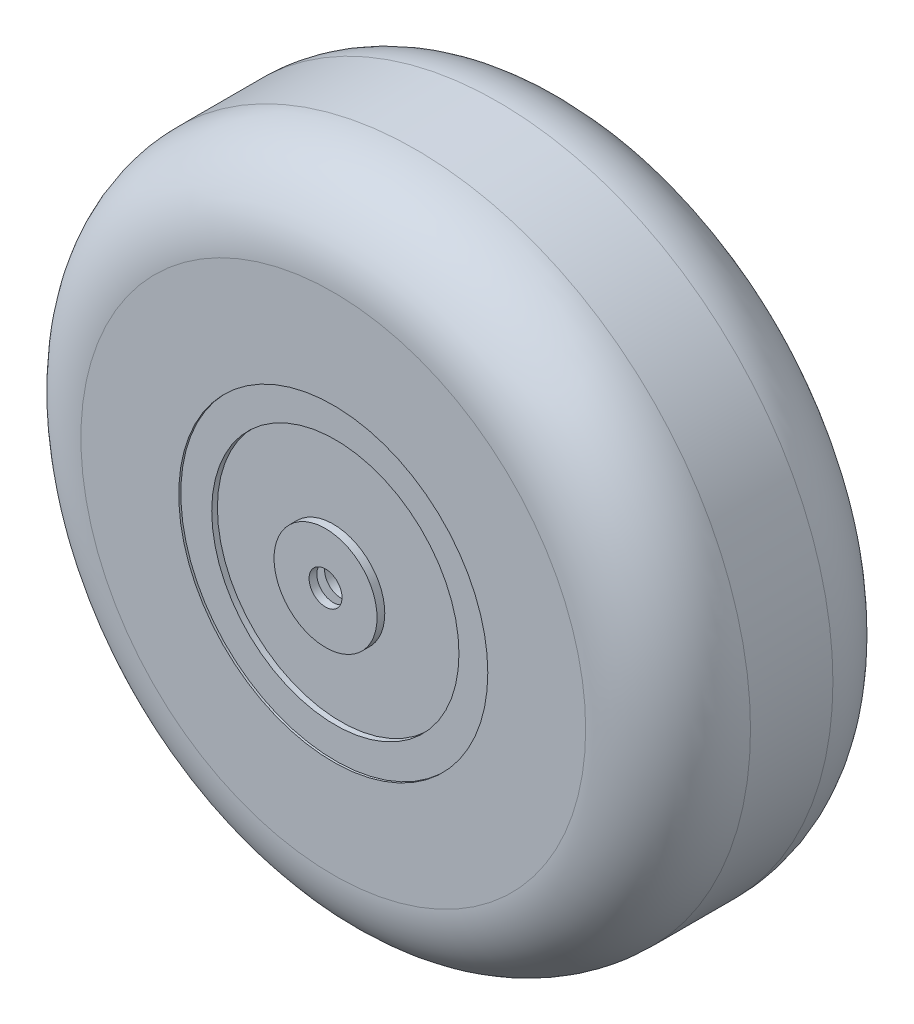
ISO-10303-21;
HEADER;
FILE_DESCRIPTION(('STEP AP214'),'2;1');
FILE_NAME('part.step','',(''),(''),'','','');
FILE_SCHEMA(('AUTOMOTIVE_DESIGN { 1 0 10303 214 1 1 1 1 }'));
ENDSEC;
DATA;
#1=APPLICATION_CONTEXT('core data for automotive mechanical design processes');
#2=APPLICATION_PROTOCOL_DEFINITION('international standard','automotive_design',2000,#1);
#3=PRODUCT_CONTEXT('',#1,'mechanical');
#4=PRODUCT('Part','Part','',(#3));
#5=PRODUCT_RELATED_PRODUCT_CATEGORY('part','',(#4));
#6=PRODUCT_DEFINITION_FORMATION('','',#4);
#7=PRODUCT_DEFINITION_CONTEXT('part definition',#1,'design');
#8=PRODUCT_DEFINITION('design','',#6,#7);
#9=PRODUCT_DEFINITION_SHAPE('','',#8);
#10=(LENGTH_UNIT() NAMED_UNIT(*) SI_UNIT(.MILLI.,.METRE.));
#11=(NAMED_UNIT(*) PLANE_ANGLE_UNIT() SI_UNIT($,.RADIAN.));
#12=(NAMED_UNIT(*) SI_UNIT($,.STERADIAN.) SOLID_ANGLE_UNIT());
#13=UNCERTAINTY_MEASURE_WITH_UNIT(LENGTH_MEASURE(1.E-05),#10,'distance_accuracy_value','');
#14=(GEOMETRIC_REPRESENTATION_CONTEXT(3) GLOBAL_UNCERTAINTY_ASSIGNED_CONTEXT((#13)) GLOBAL_UNIT_ASSIGNED_CONTEXT((#10,
#11,#12)) REPRESENTATION_CONTEXT('',''));
#15=CARTESIAN_POINT('',(0.,0.,0.));
#16=DIRECTION('',(0.,0.,1.));
#17=DIRECTION('',(1.,0.,0.));
#18=AXIS2_PLACEMENT_3D('',#15,#16,#17);
#19=CARTESIAN_POINT('',(0.,0.,24.));
#20=DIRECTION('',(0.,0.,-1.));
#21=DIRECTION('',(-1.,0.,0.));
#22=AXIS2_PLACEMENT_3D('',#19,#20,#21);
#23=CYLINDRICAL_SURFACE('',#22,1.6);
#24=CARTESIAN_POINT('',(0.,0.,0.750000000000001));
#25=DIRECTION('',(0.,0.,-1.));
#26=DIRECTION('',(-1.,0.,0.));
#27=AXIS2_PLACEMENT_3D('',#24,#25,#26);
#28=CIRCLE('',#27,1.6);
#29=CARTESIAN_POINT('',(-1.6,0.,0.750000000000001));
#30=VERTEX_POINT('',#29);
#31=EDGE_CURVE('E62',#30,#30,#28,.T.);
#32=ORIENTED_EDGE('',*,*,#31,.T.);
#33=EDGE_LOOP('',(#32));
#34=FACE_BOUND('',#33,.T.);
#35=CARTESIAN_POINT('',(0.,0.,23.25));
#36=DIRECTION('',(0.,0.,1.));
#37=DIRECTION('',(1.,0.,0.));
#38=AXIS2_PLACEMENT_3D('',#35,#36,#37);
#39=CIRCLE('',#38,1.6);
#40=CARTESIAN_POINT('',(1.6,0.,23.25));
#41=VERTEX_POINT('',#40);
#42=EDGE_CURVE('E65',#41,#41,#39,.T.);
#43=ORIENTED_EDGE('',*,*,#42,.T.);
#44=EDGE_LOOP('',(#43));
#45=FACE_BOUND('',#44,.T.);
#46=ADVANCED_FACE('F45',(#34,#45),#23,.F.);
#47=CARTESIAN_POINT('',(0.,0.,24.));
#48=DIRECTION('',(0.,0.,1.));
#49=DIRECTION('',(1.,0.,0.));
#50=AXIS2_PLACEMENT_3D('',#47,#48,#49);
#51=PLANE('',#50);
#52=CARTESIAN_POINT('',(0.,0.,24.));
#53=DIRECTION('',(0.,0.,1.));
#54=DIRECTION('',(1.,0.,0.));
#55=AXIS2_PLACEMENT_3D('',#52,#53,#54);
#56=CIRCLE('',#55,15.);
#57=CARTESIAN_POINT('',(15.,0.,24.));
#58=VERTEX_POINT('',#57);
#59=EDGE_CURVE('E59',#58,#58,#56,.T.);
#60=ORIENTED_EDGE('',*,*,#59,.F.);
#61=EDGE_LOOP('',(#60));
#62=FACE_BOUND('',#61,.T.);
#63=CARTESIAN_POINT('',(0.,0.,24.));
#64=DIRECTION('',(0.,0.,1.));
#65=DIRECTION('',(1.,0.,0.));
#66=AXIS2_PLACEMENT_3D('',#63,#64,#65);
#67=CIRCLE('',#66,24.5);
#68=CARTESIAN_POINT('',(24.5,0.,24.));
#69=VERTEX_POINT('',#68);
#70=EDGE_CURVE('E67',#69,#69,#67,.T.);
#71=ORIENTED_EDGE('',*,*,#70,.T.);
#72=EDGE_LOOP('',(#71));
#73=FACE_BOUND('',#72,.T.);
#74=ADVANCED_FACE('F102',(#62,#73),#51,.T.);
#75=CARTESIAN_POINT('',(0.,0.,0.));
#76=DIRECTION('',(0.,0.,1.));
#77=DIRECTION('',(1.,0.,0.));
#78=AXIS2_PLACEMENT_3D('',#75,#76,#77);
#79=PLANE('',#78);
#80=CARTESIAN_POINT('',(0.,0.,0.));
#81=DIRECTION('',(0.,0.,-1.));
#82=DIRECTION('',(-1.,0.,0.));
#83=AXIS2_PLACEMENT_3D('',#80,#81,#82);
#84=CIRCLE('',#83,15.);
#85=CARTESIAN_POINT('',(-15.,0.,0.));
#86=VERTEX_POINT('',#85);
#87=EDGE_CURVE('E83',#86,#86,#84,.T.);
#88=ORIENTED_EDGE('',*,*,#87,.F.);
#89=EDGE_LOOP('',(#88));
#90=FACE_BOUND('',#89,.T.);
#91=CARTESIAN_POINT('',(0.,0.,0.));
#92=DIRECTION('',(0.,0.,1.));
#93=DIRECTION('',(1.,0.,0.));
#94=AXIS2_PLACEMENT_3D('',#91,#92,#93);
#95=CIRCLE('',#94,24.5);
#96=CARTESIAN_POINT('',(24.5,0.,0.));
#97=VERTEX_POINT('',#96);
#98=EDGE_CURVE('E70',#97,#97,#95,.F.);
#99=ORIENTED_EDGE('',*,*,#98,.T.);
#100=EDGE_LOOP('',(#99));
#101=FACE_BOUND('',#100,.T.);
#102=ADVANCED_FACE('F98',(#90,#101),#79,.F.);
#103=CARTESIAN_POINT('',(0.,0.,24.));
#104=DIRECTION('',(0.,0.,-1.));
#105=DIRECTION('',(-1.,0.,0.));
#106=AXIS2_PLACEMENT_3D('',#103,#104,#105);
#107=CYLINDRICAL_SURFACE('',#106,32.5);
#108=CARTESIAN_POINT('',(0.,0.,8.));
#109=DIRECTION('',(0.,0.,1.));
#110=DIRECTION('',(1.,0.,0.));
#111=AXIS2_PLACEMENT_3D('',#108,#109,#110);
#112=CIRCLE('',#111,32.5);
#113=CARTESIAN_POINT('',(32.5,0.,8.));
#114=VERTEX_POINT('',#113);
#115=EDGE_CURVE('E73',#114,#114,#112,.T.);
#116=ORIENTED_EDGE('',*,*,#115,.T.);
#117=EDGE_LOOP('',(#116));
#118=FACE_BOUND('',#117,.T.);
#119=CARTESIAN_POINT('',(0.,0.,16.));
#120=DIRECTION('',(0.,0.,1.));
#121=DIRECTION('',(1.,0.,0.));
#122=AXIS2_PLACEMENT_3D('',#119,#120,#121);
#123=CIRCLE('',#122,32.5);
#124=CARTESIAN_POINT('',(32.5,0.,16.));
#125=VERTEX_POINT('',#124);
#126=EDGE_CURVE('E76',#125,#125,#123,.F.);
#127=ORIENTED_EDGE('',*,*,#126,.T.);
#128=EDGE_LOOP('',(#127));
#129=FACE_BOUND('',#128,.T.);
#130=ADVANCED_FACE('F101',(#118,#129),#107,.T.);
#131=CARTESIAN_POINT('',(0.,0.,8.));
#132=DIRECTION('',(0.,0.,1.));
#133=DIRECTION('',(1.,0.,0.));
#134=AXIS2_PLACEMENT_3D('',#131,#132,#133);
#135=TOROIDAL_SURFACE('',#134,24.5,8.);
#136=ORIENTED_EDGE('',*,*,#98,.F.);
#137=EDGE_LOOP('',(#136));
#138=FACE_BOUND('',#137,.T.);
#139=ORIENTED_EDGE('',*,*,#115,.F.);
#140=EDGE_LOOP('',(#139));
#141=FACE_BOUND('',#140,.T.);
#142=ADVANCED_FACE('F106',(#138,#141),#135,.T.);
#143=CARTESIAN_POINT('',(0.,0.,16.));
#144=DIRECTION('',(0.,0.,1.));
#145=DIRECTION('',(1.,0.,0.));
#146=AXIS2_PLACEMENT_3D('',#143,#144,#145);
#147=TOROIDAL_SURFACE('',#146,24.5,8.);
#148=ORIENTED_EDGE('',*,*,#126,.F.);
#149=EDGE_LOOP('',(#148));
#150=FACE_BOUND('',#149,.T.);
#151=ORIENTED_EDGE('',*,*,#70,.F.);
#152=EDGE_LOOP('',(#151));
#153=FACE_BOUND('',#152,.T.);
#154=ADVANCED_FACE('F109',(#150,#153),#147,.T.);
#155=CARTESIAN_POINT('',(0.,0.,23.8));
#156=DIRECTION('',(0.,0.,1.));
#157=DIRECTION('',(1.,0.,0.));
#158=AXIS2_PLACEMENT_3D('',#155,#156,#157);
#159=CYLINDRICAL_SURFACE('',#158,15.);
#160=CARTESIAN_POINT('',(0.,0.,23.8));
#161=DIRECTION('',(0.,0.,1.));
#162=DIRECTION('',(1.,0.,0.));
#163=AXIS2_PLACEMENT_3D('',#160,#161,#162);
#164=CIRCLE('',#163,15.);
#165=CARTESIAN_POINT('',(15.,0.,23.8));
#166=VERTEX_POINT('',#165);
#167=EDGE_CURVE('E55',#166,#166,#164,.T.);
#168=ORIENTED_EDGE('',*,*,#167,.F.);
#169=EDGE_LOOP('',(#168));
#170=FACE_BOUND('',#169,.T.);
#171=ORIENTED_EDGE('',*,*,#59,.T.);
#172=EDGE_LOOP('',(#171));
#173=FACE_BOUND('',#172,.T.);
#174=ADVANCED_FACE('F120',(#170,#173),#159,.F.);
#175=CARTESIAN_POINT('',(0.,0.,23.8));
#176=DIRECTION('',(0.,0.,1.));
#177=DIRECTION('',(1.,0.,0.));
#178=AXIS2_PLACEMENT_3D('',#175,#176,#177);
#179=PLANE('',#178);
#180=CARTESIAN_POINT('',(0.,0.,23.8));
#181=DIRECTION('',(0.,0.,1.));
#182=DIRECTION('',(1.,0.,0.));
#183=AXIS2_PLACEMENT_3D('',#180,#181,#182);
#184=CIRCLE('',#183,12.);
#185=CARTESIAN_POINT('',(12.,0.,23.8));
#186=VERTEX_POINT('',#185);
#187=EDGE_CURVE('E51',#186,#186,#184,.T.);
#188=ORIENTED_EDGE('',*,*,#187,.F.);
#189=EDGE_LOOP('',(#188));
#190=FACE_BOUND('',#189,.T.);
#191=ORIENTED_EDGE('',*,*,#167,.T.);
#192=EDGE_LOOP('',(#191));
#193=FACE_BOUND('',#192,.T.);
#194=ADVANCED_FACE('F160',(#190,#193),#179,.T.);
#195=CARTESIAN_POINT('',(0.,0.,0.75));
#196=DIRECTION('',(0.,0.,-1.));
#197=DIRECTION('',(-1.,0.,0.));
#198=AXIS2_PLACEMENT_3D('',#195,#196,#197);
#199=PLANE('',#198);
#200=ORIENTED_EDGE('',*,*,#31,.F.);
#201=EDGE_LOOP('',(#200));
#202=FACE_BOUND('',#201,.T.);
#203=CARTESIAN_POINT('',(0.,0.,0.75));
#204=DIRECTION('',(0.,0.,-1.));
#205=DIRECTION('',(-1.,0.,0.));
#206=AXIS2_PLACEMENT_3D('',#203,#204,#205);
#207=CIRCLE('',#206,15.);
#208=CARTESIAN_POINT('',(-15.,0.,0.75));
#209=VERTEX_POINT('',#208);
#210=EDGE_CURVE('E66',#209,#209,#207,.T.);
#211=ORIENTED_EDGE('',*,*,#210,.T.);
#212=EDGE_LOOP('',(#211));
#213=FACE_BOUND('',#212,.T.);
#214=ADVANCED_FACE('F89',(#202,#213),#199,.T.);
#215=CARTESIAN_POINT('',(0.,0.,23.25));
#216=DIRECTION('',(0.,0.,1.));
#217=DIRECTION('',(1.,0.,0.));
#218=AXIS2_PLACEMENT_3D('',#215,#216,#217);
#219=CYLINDRICAL_SURFACE('',#218,12.);
#220=ORIENTED_EDGE('',*,*,#187,.T.);
#221=EDGE_LOOP('',(#220));
#222=FACE_BOUND('',#221,.T.);
#223=CARTESIAN_POINT('',(0.,0.,23.25));
#224=DIRECTION('',(0.,0.,1.));
#225=DIRECTION('',(1.,0.,0.));
#226=AXIS2_PLACEMENT_3D('',#223,#224,#225);
#227=CIRCLE('',#226,12.);
#228=CARTESIAN_POINT('',(12.,0.,23.25));
#229=VERTEX_POINT('',#228);
#230=EDGE_CURVE('E11',#229,#229,#227,.T.);
#231=ORIENTED_EDGE('',*,*,#230,.F.);
#232=EDGE_LOOP('',(#231));
#233=FACE_BOUND('',#232,.T.);
#234=ADVANCED_FACE('F135',(#222,#233),#219,.F.);
#235=CARTESIAN_POINT('',(0.,0.,23.25));
#236=DIRECTION('',(0.,0.,1.));
#237=DIRECTION('',(1.,0.,0.));
#238=AXIS2_PLACEMENT_3D('',#235,#236,#237);
#239=PLANE('',#238);
#240=ORIENTED_EDGE('',*,*,#42,.F.);
#241=EDGE_LOOP('',(#240));
#242=FACE_BOUND('',#241,.T.);
#243=ORIENTED_EDGE('',*,*,#230,.T.);
#244=EDGE_LOOP('',(#243));
#245=FACE_BOUND('',#244,.T.);
#246=ADVANCED_FACE('F94',(#242,#245),#239,.T.);
#247=CARTESIAN_POINT('',(0.,0.,0.75));
#248=DIRECTION('',(0.,0.,-1.));
#249=DIRECTION('',(-1.,0.,0.));
#250=AXIS2_PLACEMENT_3D('',#247,#248,#249);
#251=CYLINDRICAL_SURFACE('',#250,15.);
#252=ORIENTED_EDGE('',*,*,#210,.F.);
#253=EDGE_LOOP('',(#252));
#254=FACE_BOUND('',#253,.T.);
#255=ORIENTED_EDGE('',*,*,#87,.T.);
#256=EDGE_LOOP('',(#255));
#257=FACE_BOUND('',#256,.T.);
#258=ADVANCED_FACE('F91',(#254,#257),#251,.F.);
#259=CLOSED_SHELL('',(#46,#74,#102,#130,#142,#154,#174,#194,#214,#234,#246,#258));
#260=MANIFOLD_SOLID_BREP('B2',#259);
#261=CARTESIAN_POINT('',(0.,0.,24.));
#262=DIRECTION('',(0.,0.,-1.));
#263=DIRECTION('',(-1.,0.,0.));
#264=AXIS2_PLACEMENT_3D('',#261,#262,#263);
#265=CYLINDRICAL_SURFACE('',#264,1.6);
#266=CARTESIAN_POINT('',(0.,0.,24.));
#267=DIRECTION('',(0.,0.,1.));
#268=DIRECTION('',(1.,0.,0.));
#269=AXIS2_PLACEMENT_3D('',#266,#267,#268);
#270=CIRCLE('',#269,1.6);
#271=CARTESIAN_POINT('',(1.6,0.,24.));
#272=VERTEX_POINT('',#271);
#273=EDGE_CURVE('E265',#272,#272,#270,.T.);
#274=ORIENTED_EDGE('',*,*,#273,.F.);
#275=EDGE_LOOP('',(#274));
#276=FACE_BOUND('',#275,.T.);
#277=CARTESIAN_POINT('',(0.,0.,24.75));
#278=DIRECTION('',(0.,0.,1.));
#279=DIRECTION('',(1.,0.,0.));
#280=AXIS2_PLACEMENT_3D('',#277,#278,#279);
#281=CIRCLE('',#280,1.6);
#282=CARTESIAN_POINT('',(1.6,0.,24.75));
#283=VERTEX_POINT('',#282);
#284=EDGE_CURVE('E258',#283,#283,#281,.T.);
#285=ORIENTED_EDGE('',*,*,#284,.T.);
#286=EDGE_LOOP('',(#285));
#287=FACE_BOUND('',#286,.T.);
#288=ADVANCED_FACE('F255',(#276,#287),#265,.F.);
#289=CARTESIAN_POINT('',(0.,0.,24.75));
#290=DIRECTION('',(0.,0.,1.));
#291=DIRECTION('',(1.,0.,0.));
#292=AXIS2_PLACEMENT_3D('',#289,#290,#291);
#293=PLANE('',#292);
#294=ORIENTED_EDGE('',*,*,#284,.F.);
#295=EDGE_LOOP('',(#294));
#296=FACE_BOUND('',#295,.T.);
#297=CARTESIAN_POINT('',(0.,0.,24.75));
#298=DIRECTION('',(0.,0.,1.));
#299=DIRECTION('',(1.,0.,0.));
#300=AXIS2_PLACEMENT_3D('',#297,#298,#299);
#301=CIRCLE('',#300,5.);
#302=CARTESIAN_POINT('',(5.,0.,24.75));
#303=VERTEX_POINT('',#302);
#304=EDGE_CURVE('E44',#303,#303,#301,.T.);
#305=ORIENTED_EDGE('',*,*,#304,.T.);
#306=EDGE_LOOP('',(#305));
#307=FACE_BOUND('',#306,.T.);
#308=ADVANCED_FACE('F282',(#296,#307),#293,.T.);
#309=CARTESIAN_POINT('',(0.,0.,24.75));
#310=DIRECTION('',(0.,0.,-1.));
#311=DIRECTION('',(-1.,0.,0.));
#312=AXIS2_PLACEMENT_3D('',#309,#310,#311);
#313=CYLINDRICAL_SURFACE('',#312,5.);
#314=ORIENTED_EDGE('',*,*,#304,.F.);
#315=EDGE_LOOP('',(#314));
#316=FACE_BOUND('',#315,.T.);
#317=CARTESIAN_POINT('',(0.,0.,24.));
#318=DIRECTION('',(0.,0.,1.));
#319=DIRECTION('',(1.,0.,0.));
#320=AXIS2_PLACEMENT_3D('',#317,#318,#319);
#321=CIRCLE('',#320,5.);
#322=CARTESIAN_POINT('',(5.,0.,24.));
#323=VERTEX_POINT('',#322);
#324=EDGE_CURVE('E269',#323,#323,#321,.T.);
#325=ORIENTED_EDGE('',*,*,#324,.T.);
#326=EDGE_LOOP('',(#325));
#327=FACE_BOUND('',#326,.T.);
#328=ADVANCED_FACE('F273',(#316,#327),#313,.T.);
#329=CARTESIAN_POINT('',(0.,0.,24.));
#330=DIRECTION('',(0.,0.,1.));
#331=DIRECTION('',(1.,0.,0.));
#332=AXIS2_PLACEMENT_3D('',#329,#330,#331);
#333=PLANE('',#332);
#334=ORIENTED_EDGE('',*,*,#273,.T.);
#335=EDGE_LOOP('',(#334));
#336=FACE_BOUND('',#335,.T.);
#337=ORIENTED_EDGE('',*,*,#324,.F.);
#338=EDGE_LOOP('',(#337));
#339=FACE_BOUND('',#338,.T.);
#340=ADVANCED_FACE('F275',(#336,#339),#333,.F.);
#341=CLOSED_SHELL('',(#288,#308,#328,#340));
#342=MANIFOLD_SOLID_BREP('B6',#341);
#343=CARTESIAN_POINT('',(0.,0.,-0.75));
#344=DIRECTION('',(0.,0.,1.));
#345=DIRECTION('',(1.,0.,0.));
#346=AXIS2_PLACEMENT_3D('',#343,#344,#345);
#347=CYLINDRICAL_SURFACE('',#346,5.);
#348=CARTESIAN_POINT('',(0.,0.,-0.75));
#349=DIRECTION('',(0.,0.,-1.));
#350=DIRECTION('',(-1.,0.,0.));
#351=AXIS2_PLACEMENT_3D('',#348,#349,#350);
#352=CIRCLE('',#351,5.);
#353=CARTESIAN_POINT('',(-5.,0.,-0.75));
#354=VERTEX_POINT('',#353);
#355=EDGE_CURVE('E254',#354,#354,#352,.T.);
#356=ORIENTED_EDGE('',*,*,#355,.F.);
#357=EDGE_LOOP('',(#356));
#358=FACE_BOUND('',#357,.T.);
#359=CARTESIAN_POINT('',(0.,0.,0.));
#360=DIRECTION('',(0.,0.,-1.));
#361=DIRECTION('',(-1.,0.,0.));
#362=AXIS2_PLACEMENT_3D('',#359,#360,#361);
#363=CIRCLE('',#362,5.);
#364=CARTESIAN_POINT('',(-5.,0.,0.));
#365=VERTEX_POINT('',#364);
#366=EDGE_CURVE('E333',#365,#365,#363,.T.);
#367=ORIENTED_EDGE('',*,*,#366,.T.);
#368=EDGE_LOOP('',(#367));
#369=FACE_BOUND('',#368,.T.);
#370=ADVANCED_FACE('F321',(#358,#369),#347,.T.);
#371=CARTESIAN_POINT('',(0.,0.,-0.75));
#372=DIRECTION('',(0.,0.,-1.));
#373=DIRECTION('',(-1.,0.,0.));
#374=AXIS2_PLACEMENT_3D('',#371,#372,#373);
#375=PLANE('',#374);
#376=CARTESIAN_POINT('',(0.,0.,-0.75));
#377=DIRECTION('',(0.,0.,-1.));
#378=DIRECTION('',(-1.,0.,0.));
#379=AXIS2_PLACEMENT_3D('',#376,#377,#378);
#380=CIRCLE('',#379,1.6);
#381=CARTESIAN_POINT('',(-1.6,0.,-0.75));
#382=VERTEX_POINT('',#381);
#383=EDGE_CURVE('E329',#382,#382,#380,.T.);
#384=ORIENTED_EDGE('',*,*,#383,.F.);
#385=EDGE_LOOP('',(#384));
#386=FACE_BOUND('',#385,.T.);
#387=ORIENTED_EDGE('',*,*,#355,.T.);
#388=EDGE_LOOP('',(#387));
#389=FACE_BOUND('',#388,.T.);
#390=ADVANCED_FACE('F347',(#386,#389),#375,.T.);
#391=CARTESIAN_POINT('',(0.,0.,24.));
#392=DIRECTION('',(0.,0.,-1.));
#393=DIRECTION('',(-1.,0.,0.));
#394=AXIS2_PLACEMENT_3D('',#391,#392,#393);
#395=CYLINDRICAL_SURFACE('',#394,1.6);
#396=CARTESIAN_POINT('',(0.,0.,0.));
#397=DIRECTION('',(0.,0.,-1.));
#398=DIRECTION('',(-1.,0.,0.));
#399=AXIS2_PLACEMENT_3D('',#396,#397,#398);
#400=CIRCLE('',#399,1.6);
#401=CARTESIAN_POINT('',(-1.6,0.,0.));
#402=VERTEX_POINT('',#401);
#403=EDGE_CURVE('E325',#402,#402,#400,.T.);
#404=ORIENTED_EDGE('',*,*,#403,.F.);
#405=EDGE_LOOP('',(#404));
#406=FACE_BOUND('',#405,.T.);
#407=ORIENTED_EDGE('',*,*,#383,.T.);
#408=EDGE_LOOP('',(#407));
#409=FACE_BOUND('',#408,.T.);
#410=ADVANCED_FACE('F323',(#406,#409),#395,.F.);
#411=CARTESIAN_POINT('',(0.,0.,0.));
#412=DIRECTION('',(0.,0.,-1.));
#413=DIRECTION('',(-1.,0.,0.));
#414=AXIS2_PLACEMENT_3D('',#411,#412,#413);
#415=PLANE('',#414);
#416=ORIENTED_EDGE('',*,*,#403,.T.);
#417=EDGE_LOOP('',(#416));
#418=FACE_BOUND('',#417,.T.);
#419=ORIENTED_EDGE('',*,*,#366,.F.);
#420=EDGE_LOOP('',(#419));
#421=FACE_BOUND('',#420,.T.);
#422=ADVANCED_FACE('F342',(#418,#421),#415,.F.);
#423=CLOSED_SHELL('',(#370,#390,#410,#422));
#424=MANIFOLD_SOLID_BREP('B39',#423);
#425=ADVANCED_BREP_SHAPE_REPRESENTATION('',(#18,#260,#342,#424),#14);
#426=SHAPE_DEFINITION_REPRESENTATION(#9,#425);
ENDSEC;
END-ISO-10303-21;
